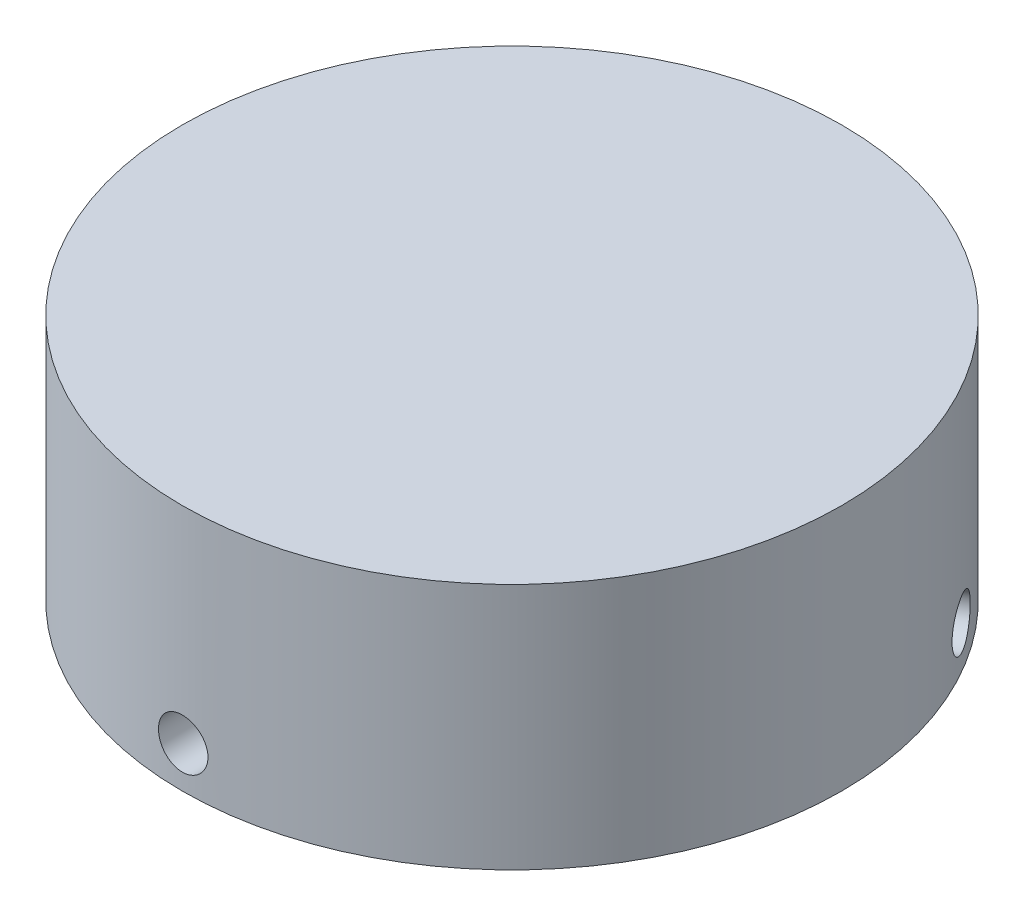
ISO-10303-21;
HEADER;
FILE_DESCRIPTION(('STEP AP214'),'2;1');
FILE_NAME('part.step','',(''),(''),'','','');
FILE_SCHEMA(('AUTOMOTIVE_DESIGN { 1 0 10303 214 1 1 1 1 }'));
ENDSEC;
DATA;
#1=APPLICATION_CONTEXT('core data for automotive mechanical design processes');
#2=APPLICATION_PROTOCOL_DEFINITION('international standard','automotive_design',2000,#1);
#3=PRODUCT_CONTEXT('',#1,'mechanical');
#4=PRODUCT('Part','Part','',(#3));
#5=PRODUCT_RELATED_PRODUCT_CATEGORY('part','',(#4));
#6=PRODUCT_DEFINITION_FORMATION('','',#4);
#7=PRODUCT_DEFINITION_CONTEXT('part definition',#1,'design');
#8=PRODUCT_DEFINITION('design','',#6,#7);
#9=PRODUCT_DEFINITION_SHAPE('','',#8);
#10=(LENGTH_UNIT() NAMED_UNIT(*) SI_UNIT(.MILLI.,.METRE.));
#11=(NAMED_UNIT(*) PLANE_ANGLE_UNIT() SI_UNIT($,.RADIAN.));
#12=(NAMED_UNIT(*) SI_UNIT($,.STERADIAN.) SOLID_ANGLE_UNIT());
#13=UNCERTAINTY_MEASURE_WITH_UNIT(LENGTH_MEASURE(1.E-05),#10,'distance_accuracy_value','');
#14=(GEOMETRIC_REPRESENTATION_CONTEXT(3) GLOBAL_UNCERTAINTY_ASSIGNED_CONTEXT((#13)) GLOBAL_UNIT_ASSIGNED_CONTEXT((#10,
#11,#12)) REPRESENTATION_CONTEXT('',''));
#15=CARTESIAN_POINT('',(0.,0.,0.));
#16=DIRECTION('',(0.,0.,1.));
#17=DIRECTION('',(1.,0.,0.));
#18=AXIS2_PLACEMENT_3D('',#15,#16,#17);
#19=CARTESIAN_POINT('',(0.,-63.9534883720931,0.));
#20=DIRECTION('',(0.,-1.,0.));
#21=DIRECTION('',(0.,0.,-1.));
#22=AXIS2_PLACEMENT_3D('',#19,#20,#21);
#23=CYLINDRICAL_SURFACE('',#22,40.);
#24=CARTESIAN_POINT('',(-36.0434508988317,5.,-17.345594463826));
#25=CARTESIAN_POINT('',(-36.0434485099029,5.1682568685558,-17.3456015996993));
#26=CARTESIAN_POINT('',(-36.0372814306523,5.33662970358921,-17.3584324834417));
#27=CARTESIAN_POINT('',(-36.012692785125,5.66872083129578,-17.4093861957378));
#28=CARTESIAN_POINT('',(-35.9942571691222,5.83243356289592,-17.4475380212816));
#29=CARTESIAN_POINT('',(-35.9454373561321,6.15034636686087,-17.5478952755415));
#30=CARTESIAN_POINT('',(-35.9150597301995,6.30455161679832,-17.6100874758004));
#31=CARTESIAN_POINT('',(-35.8428802841703,6.59914501091521,-17.756535842124));
#32=CARTESIAN_POINT('',(-35.8010809816004,6.7395361906805,-17.8407871458263));
#33=CARTESIAN_POINT('',(-35.7067170207569,7.00285004756748,-18.028905141259));
#34=CARTESIAN_POINT('',(-35.6541324482741,7.12573968779151,-18.1328080902756));
#35=CARTESIAN_POINT('',(-35.5392589522166,7.35027864929544,-18.3569304798962));
#36=CARTESIAN_POINT('',(-35.4769696132881,7.45192706103727,-18.47715061883));
#37=CARTESIAN_POINT('',(-35.343915021324,7.63120510416941,-18.7304064029075));
#38=CARTESIAN_POINT('',(-35.2731399709938,7.70880659418914,-18.8634568260775));
#39=CARTESIAN_POINT('',(-35.1247947586744,7.8376079242409,-19.1382640007978));
#40=CARTESIAN_POINT('',(-35.0472246955477,7.88880814831743,-19.2800206256703));
#41=CARTESIAN_POINT('',(-34.8873785317623,7.96325967860896,-19.567775599993));
#42=CARTESIAN_POINT('',(-34.8051116423367,7.98656384595592,-19.7137653882387));
#43=CARTESIAN_POINT('',(-34.6379542723222,8.00472508444834,-20.0060104969881));
#44=CARTESIAN_POINT('',(-34.5530638322075,7.99958259423026,-20.1522658133626));
#45=CARTESIAN_POINT('',(-34.3832793116365,7.96103987829183,-20.440598017982));
#46=CARTESIAN_POINT('',(-34.2983855818404,7.92769650231577,-20.5826827179069));
#47=CARTESIAN_POINT('',(-34.1310079202001,7.83378683220311,-20.8590607896552));
#48=CARTESIAN_POINT('',(-34.0485240075631,7.77322032115078,-20.9933540993866));
#49=CARTESIAN_POINT('',(-33.8885227127553,7.62651983963334,-21.250671312474));
#50=CARTESIAN_POINT('',(-33.8110103967526,7.54036027721805,-21.3736837735614));
#51=CARTESIAN_POINT('',(-33.6636297460356,7.34493803881548,-21.6050660641836));
#52=CARTESIAN_POINT('',(-33.5937615364539,7.23567498471384,-21.7134356540238));
#53=CARTESIAN_POINT('',(-33.4639307435979,6.99682664068514,-21.9130002114594));
#54=CARTESIAN_POINT('',(-33.4039929733102,6.86719197616823,-22.0041522350926));
#55=CARTESIAN_POINT('',(-33.2963918719693,6.59145272534244,-22.1666374512936));
#56=CARTESIAN_POINT('',(-33.2487285484692,6.44534812889871,-22.2379706316657));
#57=CARTESIAN_POINT('',(-33.1674417589666,6.14078299125034,-22.3590283895546));
#58=CARTESIAN_POINT('',(-33.1338195822937,5.98232131694056,-22.4087509826942));
#59=CARTESIAN_POINT('',(-33.0819019062815,5.65755583878136,-22.4853268872282));
#60=CARTESIAN_POINT('',(-33.063606146597,5.4912521681923,-22.5121805870899));
#61=CARTESIAN_POINT('',(-33.0430736411475,5.15595684618506,-22.5423073958953));
#62=CARTESIAN_POINT('',(-33.0407979103687,4.98697272381689,-22.5456377493711));
#63=CARTESIAN_POINT('',(-33.0522904001772,4.650732480299,-22.5287860142545));
#64=CARTESIAN_POINT('',(-33.0660584999243,4.48347634614387,-22.5086041027534));
#65=CARTESIAN_POINT('',(-33.1090812380939,4.15563685328747,-22.445270932589));
#66=CARTESIAN_POINT('',(-33.1383179166718,3.99504598856854,-22.402146311314));
#67=CARTESIAN_POINT('',(-33.2111557127067,3.68486346525242,-22.2940207406841));
#68=CARTESIAN_POINT('',(-33.2547570174012,3.53527195005865,-22.2290195061757));
#69=CARTESIAN_POINT('',(-33.3548010143253,3.2510178948854,-22.0786184214921));
#70=CARTESIAN_POINT('',(-33.4112682959468,3.11638468579604,-21.9931794951057));
#71=CARTESIAN_POINT('',(-33.5349513642252,2.86616500351318,-21.8041226276575));
#72=CARTESIAN_POINT('',(-33.6021673010943,2.75057879654675,-21.7005044325391));
#73=CARTESIAN_POINT('',(-33.7451344860045,2.54149949578429,-21.4775101342881));
#74=CARTESIAN_POINT('',(-33.8209025900598,2.44805119861195,-21.3581028291068));
#75=CARTESIAN_POINT('',(-33.978290512558,2.28620736981222,-21.1068169829454));
#76=CARTESIAN_POINT('',(-34.0599102821422,2.21781162903718,-20.9749385460904));
#77=CARTESIAN_POINT('',(-34.2262530314192,2.10809178329002,-20.7023922223846));
#78=CARTESIAN_POINT('',(-34.3109727073773,2.06673969558153,-20.5617335862905));
#79=CARTESIAN_POINT('',(-34.4809612959082,2.01218948059973,-20.2753796330501));
#80=CARTESIAN_POINT('',(-34.566230200236,1.9989909316717,-20.12968439137));
#81=CARTESIAN_POINT('',(-34.7346028700775,2.00112697442154,-19.8377340381758));
#82=CARTESIAN_POINT('',(-34.8177114351049,2.01639162912749,-19.6914811778025));
#83=CARTESIAN_POINT('',(-34.9797038345022,2.074875287663,-19.4022628445248));
#84=CARTESIAN_POINT('',(-35.0585876623101,2.11809433490976,-19.2592973767265));
#85=CARTESIAN_POINT('',(-35.2101249700807,2.23124296108666,-18.9808389329815));
#86=CARTESIAN_POINT('',(-35.2827786533884,2.30117166783664,-18.8453457132005));
#87=CARTESIAN_POINT('',(-35.4201619389372,2.46574606550691,-18.5858470491346));
#88=CARTESIAN_POINT('',(-35.4848917010844,2.56039125752356,-18.4618413730415));
#89=CARTESIAN_POINT('',(-35.6051854717505,2.77197362151664,-18.2287695213581));
#90=CARTESIAN_POINT('',(-35.6607277786153,2.88896220622358,-18.1197388182444));
#91=CARTESIAN_POINT('',(-35.7613780889198,3.14182472905697,-17.9202777392854));
#92=CARTESIAN_POINT('',(-35.8064835509577,3.27770325407113,-17.8298518943695));
#93=CARTESIAN_POINT('',(-35.8854769925181,3.56470461656404,-17.6703282958382));
#94=CARTESIAN_POINT('',(-35.9193469658944,3.71585142240695,-17.601264789646));
#95=CARTESIAN_POINT('',(-35.975153523787,4.02881845787131,-17.4869212490252));
#96=CARTESIAN_POINT('',(-35.9971039406574,4.19062607020459,-17.441613648561));
#97=CARTESIAN_POINT('',(-36.023083014419,4.4611699703097,-17.387869282753));
#98=CARTESIAN_POINT('',(-36.0307146053878,4.56816226000275,-17.372039165491));
#99=CARTESIAN_POINT('',(-36.0408993111863,4.78342034931307,-17.3508994702492));
#100=CARTESIAN_POINT('',(-36.0434524366832,4.8916861462549,-17.3455898701714));
#101=CARTESIAN_POINT('',(-36.0434508988317,5.,-17.345594463826));
#102=B_SPLINE_CURVE_WITH_KNOTS('',3,(#24,#25,#26,#27,#28,#29,#30,#31,#32,#33,#34,#35,#36,#37,
#38,#39,#40,#41,#42,#43,#44,#45,#46,#47,#48,#49,#50,#51,#52,#53,#54,#55,#56,#57,#58,#59,#60,#61,
#62,#63,#64,#65,#66,#67,#68,#69,#70,#71,#72,#73,#74,#75,#76,#77,#78,#79,#80,#81,#82,#83,#84,#85,
#86,#87,#88,#89,#90,#91,#92,#93,#94,#95,#96,#97,#98,#99,#100,#101),.UNSPECIFIED.,.T.,.F.,(4,2,2,
2,2,2,2,2,2,2,2,2,2,2,2,2,2,2,2,2,2,2,2,2,2,2,2,2,2,2,2,2,2,2,2,2,2,2,4),(0.,0.504375158678085,
1.00932891572159,1.51400521152437,2.01857035792287,2.52407567218004,3.0296026274716,
3.53571897042052,4.04182795096937,4.54697636348321,5.05211698682554,5.55624172519159,
6.06037048052796,6.5650050497415,7.06964787850087,7.5755332281276,8.08141888905544,
8.58735099277641,9.09327450220475,9.59796641118963,10.1026545189226,10.6067579386191,
11.110867929372,11.6159495765132,12.1210382827706,12.6271404816974,13.1332384554068,
13.638811924989,14.1443778225593,14.6487031301784,15.1530292210894,15.6573388450885,
16.1616382903561,16.6671124356828,17.1727095361933,17.6791130423731,18.1849276168994,
18.5096152946703,18.8343022904443),.UNSPECIFIED.);
#103=CARTESIAN_POINT('',(-36.0434508988317,5.,-17.345594463826));
#104=VERTEX_POINT('',#103);
#105=EDGE_CURVE('E92',#104,#104,#102,.T.);
#106=ORIENTED_EDGE('',*,*,#105,.F.);
#107=EDGE_LOOP('',(#106));
#108=FACE_BOUND('',#107,.T.);
#109=CARTESIAN_POINT('',(33.043450898832,5.,-22.5417468865321));
#110=CARTESIAN_POINT('',(33.0434558842151,5.1682568685558,-22.5417412497224));
#111=CARTESIAN_POINT('',(33.0514842158638,5.33662970358921,-22.5299849605531));
#112=CARTESIAN_POINT('',(33.0833171023657,5.66872083129578,-22.4832137127338));
#113=CARTESIAN_POINT('',(33.107139744486,5.83243356289592,-22.4481720881691));
#114=CARTESIAN_POINT('',(33.169641769634,6.15034636686087,-22.3557142627817));
#115=CARTESIAN_POINT('',(33.2083129820091,6.30455161679832,-22.2983103668879));
#116=CARTESIAN_POINT('',(33.2990512645736,6.59914501091521,-22.1625769498337));
#117=CARTESIAN_POINT('',(33.3511153825967,6.7395361906805,-22.0842520400966));
#118=CARTESIAN_POINT('',(33.4668483651288,7.00285004756747,-21.908471455088));
#119=CARTESIAN_POINT('',(33.5305386722639,7.1257396877915,-21.8109804049625));
#120=CARTESIAN_POINT('',(33.6671976072033,7.35027864929544,-21.5994358443449));
#121=CARTESIAN_POINT('',(33.7401666321023,7.45192706103727,-21.4853816249809));
#122=CARTESIAN_POINT('',(33.8929652787866,7.63120510416941,-21.2435250762111));
#123=CARTESIAN_POINT('',(33.9728028000711,7.70880659418913,-21.115706873086));
#124=CARTESIAN_POINT('',(34.1366201883614,7.83760792424089,-20.8498325633275));
#125=CARTESIAN_POINT('',(34.2205999950923,7.88880814831743,-20.7117766056504));
#126=CARTESIAN_POINT('',(34.3898800310285,7.96325967860896,-20.4294682799533));
#127=CARTESIAN_POINT('',(34.4751774516295,7.98656384595592,-20.2852281696976));
#128=CARTESIAN_POINT('',(34.644690454931,8.00472508444834,-19.9943430864605));
#129=CARTESIAN_POINT('',(34.7289060542926,7.99958259423026,-19.8476981505955));
#130=CARTESIAN_POINT('',(34.8937168079366,7.96103987829183,-19.556494340302));
#131=CARTESIAN_POINT('',(34.9743189026626,7.92769650231577,-19.4119318637141));
#132=CARTESIAN_POINT('',(35.1299805030254,7.83378683220312,-19.1287895208334));
#133=CARTESIAN_POINT('',(35.2050399644926,7.77322032115079,-18.9902097022205));
#134=CARTESIAN_POINT('',(35.3478825604534,7.62651983963334,-18.7229859097349));
#135=CARTESIAN_POINT('',(35.4156583187358,7.54036027721805,-18.5943520444267));
#136=CARTESIAN_POINT('',(35.5423509350419,7.34493803881549,-18.3510255115683));
#137=CARTESIAN_POINT('',(35.6012676480504,7.23567498471385,-18.2363330722336));
#138=CARTESIAN_POINT('',(35.7091802280566,6.99682664068515,-18.024114028709));
#139=CARTESIAN_POINT('',(35.7581513109855,6.86719197616823,-17.9266303851771));
#140=CARTESIAN_POINT('',(35.8450670852845,6.59145272534244,-17.7522024898402));
#141=CARTESIAN_POINT('',(35.8830117698695,6.44534812889871,-17.6752582506742));
#142=CARTESIAN_POINT('',(35.9472074687751,6.14078299125034,-17.5443329470284));
#143=CARTESIAN_POINT('',(35.9734574092396,5.98232131694056,-17.4903539913294));
#144=CARTESIAN_POINT('',(36.0138152498777,5.65755583878137,-17.4071040127304));
#145=CARTESIAN_POINT('',(36.0279233563013,5.4912521681923,-17.3778325701312));
#146=CARTESIAN_POINT('',(36.043747685337,5.15595684618506,-17.3449874944058));
#147=CARTESIAN_POINT('',(36.0454939906612,4.98697272381689,-17.3413514770013));
#148=CARTESIAN_POINT('',(36.0366462048566,4.65073248029901,-17.3597301326865));
#149=CARTESIAN_POINT('',(36.0260522066733,4.48347634614387,-17.38174461258));
#150=CARTESIAN_POINT('',(35.9927154414936,4.15563685328747,-17.4506699818574));
#151=CARTESIAN_POINT('',(35.9699867632298,3.99504598856854,-17.4975519988656));
#152=CARTESIAN_POINT('',(35.9127661702831,3.68486346525242,-17.6146941659025));
#153=CARTESIAN_POINT('',(35.8782741022687,3.53527195005865,-17.6849546206602));
#154=CARTESIAN_POINT('',(35.798044940638,3.25101789488541,-17.8467958058345));
#155=CARTESIAN_POINT('',(35.752286300726,3.11638468579605,-17.9384173693945));
#156=CARTESIAN_POINT('',(35.6503997848952,2.86616500351319,-18.1400584822657));
#157=CARTESIAN_POINT('',(35.5942717640629,2.75057879654675,-18.2500782886927));
#158=CARTESIAN_POINT('',(35.4726366293336,2.54149949578429,-18.485388651858));
#159=CARTESIAN_POINT('',(35.4071109216768,2.44805119861195,-18.6107094073572));
#160=CARTESIAN_POINT('',(35.2681849565387,2.28620736981222,-18.8726542695701));
#161=CARTESIAN_POINT('',(35.1947847648029,2.21781162903719,-19.0092782819086));
#162=CARTESIAN_POINT('',(35.0419240994041,2.10809178329002,-19.2896084903707));
#163=CARTESIAN_POINT('',(34.962469985264,2.06673969558153,-19.4333071999979));
#164=CARTESIAN_POINT('',(34.7994744815492,2.01218948059972,-19.7236986126393));
#165=CARTESIAN_POINT('',(34.7159331532076,1.9989909316717,-19.8703912707801));
#166=CARTESIAN_POINT('',(34.5472830656183,2.00112697442154,-20.1621814567629));
#167=CARTESIAN_POINT('',(34.4621786556727,2.01639162912749,-20.3072820155354));
#168=CARTESIAN_POINT('',(34.2927044315126,2.074875287663,-20.5921807152723));
#169=CARTESIAN_POINT('',(34.2083346184393,2.11809433490976,-20.7319788480008));
#170=CARTESIAN_POINT('',(34.0429511861432,2.23124296108666,-21.0024432280238));
#171=CARTESIAN_POINT('',(33.9619374574261,2.30117166783664,-21.1331097733373));
#172=CARTESIAN_POINT('',(33.8058966648713,2.46574606550691,-21.3818365207108));
#173=CARTESIAN_POINT('',(33.7308694802348,2.56039125752355,-21.4998969771577));
#174=CARTESIAN_POINT('',(33.5891702211029,2.77197362151663,-21.7206103643133));
#175=CARTESIAN_POINT('',(33.5225180158464,2.88896220622357,-21.8232267645999));
#176=CARTESIAN_POINT('',(33.400104809554,3.14182472905697,-22.0101230297019));
#177=CARTESIAN_POINT('',(33.3443464617171,3.27770325407113,-22.0943984281341));
#178=CARTESIAN_POINT('',(33.245691693666,3.56470461656404,-22.2425705545234));
#179=CARTESIAN_POINT('',(33.2028159295173,3.71585142240695,-22.3064345649889));
#180=CARTESIAN_POINT('',(33.1316947975274,4.02881845787131,-22.4119362321321));
#181=CARTESIAN_POINT('',(33.1034324729761,4.19062607020459,-22.4535996509975));
#182=CARTESIAN_POINT('',(33.0698780237569,4.4611699703097,-22.5029703717459));
#183=CARTESIAN_POINT('',(33.0599845355475,4.56816226000274,-22.5174945820272));
#184=CARTESIAN_POINT('',(33.046769375339,4.78342034931307,-22.5368846435997));
#185=CARTESIAN_POINT('',(33.0434476895361,4.8916861462549,-22.5417505151779));
#186=CARTESIAN_POINT('',(33.043450898832,5.,-22.5417468865321));
#187=B_SPLINE_CURVE_WITH_KNOTS('',3,(#109,#110,#111,#112,#113,#114,#115,#116,#117,#118,#119,
#120,#121,#122,#123,#124,#125,#126,#127,#128,#129,#130,#131,#132,#133,#134,#135,#136,#137,#138,
#139,#140,#141,#142,#143,#144,#145,#146,#147,#148,#149,#150,#151,#152,#153,#154,#155,#156,#157,
#158,#159,#160,#161,#162,#163,#164,#165,#166,#167,#168,#169,#170,#171,#172,#173,#174,#175,#176,
#177,#178,#179,#180,#181,#182,#183,#184,#185,#186),.UNSPECIFIED.,.T.,.F.,(4,2,2,2,2,2,2,2,2,2,2,
2,2,2,2,2,2,2,2,2,2,2,2,2,2,2,2,2,2,2,2,2,2,2,2,2,2,2,4),(0.,0.504375158678084,1.00932891572159,
1.51400521152437,2.01857035792286,2.52407567218003,3.0296026274716,3.5357189704205,
4.04182795096935,4.5469763634832,5.05211698682554,5.55624172519158,6.06037048052794,
6.56500504974148,7.06964787850086,7.57553322812759,8.08141888905544,8.5873509927764,
9.09327450220474,9.59796641118962,10.1026545189226,10.6067579386191,11.110867929372,
11.6159495765132,12.1210382827706,12.6271404816974,13.1332384554068,13.638811924989,
14.1443778225593,14.6487031301784,15.1530292210894,15.6573388450885,16.1616382903561,
16.6671124356828,17.1727095361933,17.6791130423731,18.1849276168994,18.5096152946703,
18.8343022904443),.UNSPECIFIED.);
#188=CARTESIAN_POINT('',(33.043450898832,5.,-22.5417468865321));
#189=VERTEX_POINT('',#188);
#190=EDGE_CURVE('E96',#189,#189,#187,.T.);
#191=ORIENTED_EDGE('',*,*,#190,.F.);
#192=EDGE_LOOP('',(#191));
#193=FACE_BOUND('',#192,.T.);
#194=CARTESIAN_POINT('',(3.,5.,39.8873413503583));
#195=CARTESIAN_POINT('',(2.99999262568802,5.1682568685558,39.8873428494219));
#196=CARTESIAN_POINT('',(2.98579721478878,5.33662970358921,39.8884174439949));
#197=CARTESIAN_POINT('',(2.92937568275962,5.66872083129578,39.8925999084717));
#198=CARTESIAN_POINT('',(2.88711742463658,5.83243356289592,39.8957101094508));
#199=CARTESIAN_POINT('',(2.77579558649838,6.15034636686087,39.9036095383233));
#200=CARTESIAN_POINT('',(2.7067467481906,6.30455161679832,39.9083978426884));
#201=CARTESIAN_POINT('',(2.54382901959703,6.59914501091521,39.9191127919579));
#202=CARTESIAN_POINT('',(2.44996559900398,6.7395361906805,39.925039185923));
#203=CARTESIAN_POINT('',(2.23986865562846,7.00285004756747,39.9373765963472));
#204=CARTESIAN_POINT('',(2.12359377601058,7.1257396877915,39.9437884952383));
#205=CARTESIAN_POINT('',(1.87206134501354,7.35027864929543,39.9563663242412));
#206=CARTESIAN_POINT('',(1.73680298118608,7.45192706103727,39.9625322438111));
#207=CARTESIAN_POINT('',(1.4509497425376,7.63120510416941,39.9739314791187));
#208=CARTESIAN_POINT('',(1.300337170923,7.70880659418914,39.9791636991637));
#209=CARTESIAN_POINT('',(0.988174570313298,7.8376079242409,39.9880965641254));
#210=CARTESIAN_POINT('',(0.826624700455656,7.88880814831743,39.9917972313208));
#211=CARTESIAN_POINT('',(0.497498500734078,7.96325967860896,39.9972438799465));
#212=CARTESIAN_POINT('',(0.329934190707409,7.98656384595592,39.9989935579364));
#213=CARTESIAN_POINT('',(-0.00673618260852872,8.00472508444834,40.0003535834487));
#214=CARTESIAN_POINT('',(-0.175842222084783,7.99958259423026,39.9999639639583));
#215=CARTESIAN_POINT('',(-0.510437496299822,7.96103987829183,39.9970923582842));
#216=CARTESIAN_POINT('',(-0.675933320821946,7.92769650231577,39.9946145816211));
#217=CARTESIAN_POINT('',(-0.998972582825042,7.83378683220311,39.9878503104887));
#218=CARTESIAN_POINT('',(-1.15651595692924,7.77322032115078,39.9835638016073));
#219=CARTESIAN_POINT('',(-1.45935984769784,7.62651983963334,39.9736572222091));
#220=CARTESIAN_POINT('',(-1.60464792198295,7.54036027721805,39.9680358179883));
#221=CARTESIAN_POINT('',(-1.87872118900609,7.34493803881548,39.9560915757521));
#222=CARTESIAN_POINT('',(-2.00750611159625,7.23567498471385,39.9497687262575));
#223=CARTESIAN_POINT('',(-2.24524948445845,6.99682664068515,39.9371142401685));
#224=CARTESIAN_POINT('',(-2.35415833767499,6.86719197616823,39.9307826202698));
#225=CARTESIAN_POINT('',(-2.54867521331495,6.59145272534244,39.9188399411339));
#226=CARTESIAN_POINT('',(-2.63428322139997,6.44534812889871,39.9132288823401));
#227=CARTESIAN_POINT('',(-2.7797657098083,6.14078299125034,39.9033613365832));
#228=CARTESIAN_POINT('',(-2.8396378269456,5.98232131694056,39.8991049740237));
#229=CARTESIAN_POINT('',(-2.9319133435959,5.65755583878137,39.8924308999587));
#230=CARTESIAN_POINT('',(-2.96431720970403,5.4912521681923,39.8900131572212));
#231=CARTESIAN_POINT('',(-3.00067404418927,5.15595684618506,39.8872948903014));
#232=CARTESIAN_POINT('',(-3.00469608029231,4.98697272381689,39.8869892263727));
#233=CARTESIAN_POINT('',(-2.98435580467917,4.650732480299,39.8885161469412));
#234=CARTESIAN_POINT('',(-2.95999370674874,4.48347634614387,39.8903487153335));
#235=CARTESIAN_POINT('',(-2.88363420339939,4.15563685328747,39.8959409144466));
#236=CARTESIAN_POINT('',(-2.8316688465577,3.99504598856854,39.8996983101798));
#237=CARTESIAN_POINT('',(-2.70161045757609,3.68486346525242,39.9087149065868));
#238=CARTESIAN_POINT('',(-2.62351708486722,3.53527195005865,39.9139741268361));
#239=CARTESIAN_POINT('',(-2.44324392631239,3.2510178948854,39.9254142273267));
#240=CARTESIAN_POINT('',(-2.34101800477895,3.11638468579604,39.9315968645004));
#241=CARTESIAN_POINT('',(-2.11544842066971,2.86616500351318,39.9441811099234));
#242=CARTESIAN_POINT('',(-1.99210446296835,2.75057879654675,39.950582721232));
#243=CARTESIAN_POINT('',(-1.7275021433288,2.54149949578429,39.9628987861463));
#244=CARTESIAN_POINT('',(-1.58620833161667,2.44805119861195,39.9688122364642));
#245=CARTESIAN_POINT('',(-1.28989444398038,2.28620736981222,39.9794712525157));
#246=CARTESIAN_POINT('',(-1.13487448266042,2.21781162903718,39.9842168279992));
#247=CARTESIAN_POINT('',(-0.815671067984652,2.10809178329002,39.9920007127554));
#248=CARTESIAN_POINT('',(-0.651497277886454,2.06673969558153,39.9950407862885));
#249=CARTESIAN_POINT('',(-0.318513185640664,2.01218948059973,39.9990782456896));
#250=CARTESIAN_POINT('',(-0.149702952971289,1.9989909316717,40.0000756621502));
#251=CARTESIAN_POINT('',(0.187319804459422,2.00112697442154,39.9999154949388));
#252=CARTESIAN_POINT('',(0.35553277943255,2.01639162912749,39.9987631933381));
#253=CARTESIAN_POINT('',(0.686999402989866,2.074875287663,39.9944435597973));
#254=CARTESIAN_POINT('',(0.850253043871079,2.11809433490976,39.9912762247275));
#255=CARTESIAN_POINT('',(1.16717378393784,2.23124296108666,39.9832821610055));
#256=CARTESIAN_POINT('',(1.32084119596258,2.30117166783664,39.9784554865379));
#257=CARTESIAN_POINT('',(1.61426527406613,2.46574606550691,39.9676835698456));
#258=CARTESIAN_POINT('',(1.75402222084985,2.56039125752355,39.9617383501994));
#259=CARTESIAN_POINT('',(2.01601525064781,2.77197362151663,39.9493798856716));
#260=CARTESIAN_POINT('',(2.1382097627692,2.88896220622358,39.9429655828445));
#261=CARTESIAN_POINT('',(2.36127327936613,3.14182472905697,39.9304007689875));
#262=CARTESIAN_POINT('',(2.46213708924093,3.27770325407114,39.9242503225038));
#263=CARTESIAN_POINT('',(2.63978529885239,3.56470461656404,39.9128988503618));
#264=CARTESIAN_POINT('',(2.71653103637741,3.71585142240695,39.907699354635));
#265=CARTESIAN_POINT('',(2.84345872625994,4.02881845787131,39.8988574811574));
#266=CARTESIAN_POINT('',(2.89367146768162,4.19062607020459,39.8952132995587));
#267=CARTESIAN_POINT('',(2.95320499066245,4.4611699703097,39.8908396544991));
#268=CARTESIAN_POINT('',(2.97073006984063,4.56816226000275,39.8895337475184));
#269=CARTESIAN_POINT('',(2.99412993584758,4.78342034931307,39.887784113849));
#270=CARTESIAN_POINT('',(3.00000474714736,4.8916861462549,39.8873403853495));
#271=CARTESIAN_POINT('',(3.,5.,39.8873413503583));
#272=B_SPLINE_CURVE_WITH_KNOTS('',3,(#194,#195,#196,#197,#198,#199,#200,#201,#202,#203,#204,
#205,#206,#207,#208,#209,#210,#211,#212,#213,#214,#215,#216,#217,#218,#219,#220,#221,#222,#223,
#224,#225,#226,#227,#228,#229,#230,#231,#232,#233,#234,#235,#236,#237,#238,#239,#240,#241,#242,
#243,#244,#245,#246,#247,#248,#249,#250,#251,#252,#253,#254,#255,#256,#257,#258,#259,#260,#261,
#262,#263,#264,#265,#266,#267,#268,#269,#270,#271),.UNSPECIFIED.,.T.,.F.,(4,2,2,2,2,2,2,2,2,2,2,
2,2,2,2,2,2,2,2,2,2,2,2,2,2,2,2,2,2,2,2,2,2,2,2,2,2,2,4),(0.,0.504375158678084,1.00932891572159,
1.51400521152437,2.01857035792286,2.52407567218003,3.0296026274716,3.53571897042051,
4.04182795096936,4.54697636348321,5.05211698682554,5.55624172519159,6.06037048052796,
6.56500504974149,7.06964787850087,7.57553322812759,8.08141888905544,8.58735099277641,
9.09327450220475,9.59796641118963,10.1026545189226,10.6067579386191,11.110867929372,
11.6159495765132,12.1210382827706,12.6271404816974,13.1332384554068,13.638811924989,
14.1443778225593,14.6487031301784,15.1530292210894,15.6573388450885,16.1616382903561,
16.6671124356828,17.1727095361933,17.6791130423731,18.1849276168994,18.5096152946703,
18.8343022904443),.UNSPECIFIED.);
#273=CARTESIAN_POINT('',(3.,5.,39.8873413503583));
#274=VERTEX_POINT('',#273);
#275=EDGE_CURVE('E52',#274,#274,#272,.T.);
#276=ORIENTED_EDGE('',*,*,#275,.F.);
#277=EDGE_LOOP('',(#276));
#278=FACE_BOUND('',#277,.T.);
#279=CARTESIAN_POINT('',(0.,0.,0.));
#280=DIRECTION('',(0.,-1.,0.));
#281=DIRECTION('',(0.,0.,-1.));
#282=AXIS2_PLACEMENT_3D('',#279,#280,#281);
#283=CIRCLE('',#282,40.);
#284=CARTESIAN_POINT('',(0.,0.,-40.));
#285=VERTEX_POINT('',#284);
#286=EDGE_CURVE('E47',#285,#285,#283,.T.);
#287=ORIENTED_EDGE('',*,*,#286,.F.);
#288=EDGE_LOOP('',(#287));
#289=FACE_BOUND('',#288,.T.);
#290=CARTESIAN_POINT('',(0.,30.,0.));
#291=DIRECTION('',(0.,-1.,0.));
#292=DIRECTION('',(0.,0.,-1.));
#293=AXIS2_PLACEMENT_3D('',#290,#291,#292);
#294=CIRCLE('',#293,40.);
#295=CARTESIAN_POINT('',(0.,30.,-40.));
#296=VERTEX_POINT('',#295);
#297=EDGE_CURVE('E10',#296,#296,#294,.T.);
#298=ORIENTED_EDGE('',*,*,#297,.T.);
#299=EDGE_LOOP('',(#298));
#300=FACE_BOUND('',#299,.T.);
#301=ADVANCED_FACE('F33',(#108,#193,#278,#289,#300),#23,.T.);
#302=CARTESIAN_POINT('',(-40.,30.,0.));
#303=DIRECTION('',(0.,-1.,0.));
#304=DIRECTION('',(0.,0.,-1.));
#305=AXIS2_PLACEMENT_3D('',#302,#303,#304);
#306=PLANE('',#305);
#307=ORIENTED_EDGE('',*,*,#297,.F.);
#308=EDGE_LOOP('',(#307));
#309=FACE_BOUND('',#308,.T.);
#310=ADVANCED_FACE('F80',(#309),#306,.F.);
#311=CARTESIAN_POINT('',(0.,25.,0.));
#312=DIRECTION('',(0.,1.,0.));
#313=DIRECTION('',(0.,0.,1.));
#314=AXIS2_PLACEMENT_3D('',#311,#312,#313);
#315=PLANE('',#314);
#316=CARTESIAN_POINT('',(0.,25.,0.));
#317=DIRECTION('',(0.,-1.,0.));
#318=DIRECTION('',(0.,0.,-1.));
#319=AXIS2_PLACEMENT_3D('',#316,#317,#318);
#320=CIRCLE('',#319,35.);
#321=CARTESIAN_POINT('',(0.,25.,-35.));
#322=VERTEX_POINT('',#321);
#323=EDGE_CURVE('E39',#322,#322,#320,.T.);
#324=ORIENTED_EDGE('',*,*,#323,.T.);
#325=EDGE_LOOP('',(#324));
#326=FACE_BOUND('',#325,.T.);
#327=ADVANCED_FACE('F77',(#326),#315,.F.);
#328=CARTESIAN_POINT('',(0.,-63.9534883720931,0.));
#329=DIRECTION('',(0.,-1.,0.));
#330=DIRECTION('',(0.,0.,-1.));
#331=AXIS2_PLACEMENT_3D('',#328,#329,#330);
#332=CYLINDRICAL_SURFACE('',#331,35.);
#333=CARTESIAN_POINT('',(-31.6993377410829,5.,-14.8375195628095));
#334=CARTESIAN_POINT('',(-31.6993355474285,4.83182110220312,-14.8375267706995));
#335=CARTESIAN_POINT('',(-31.6933079127272,4.6635281444135,-14.8504230419554));
#336=CARTESIAN_POINT('',(-31.6692637457543,4.33159992889202,-14.9016275265098));
#337=CARTESIAN_POINT('',(-31.6512336780234,4.16797014744623,-14.9399644297251));
#338=CARTESIAN_POINT('',(-31.6034490090532,3.85022368351939,-15.0407813611578));
#339=CARTESIAN_POINT('',(-31.5737011153164,3.69610161691769,-15.1032475769103));
#340=CARTESIAN_POINT('',(-31.5029384740131,3.40165820131931,-15.2502948544938));
#341=CARTESIAN_POINT('',(-31.4619261125039,3.26133393818889,-15.3348712327325));
#342=CARTESIAN_POINT('',(-31.3691852996159,2.99805317899114,-15.5237003256633));
#343=CARTESIAN_POINT('',(-31.3174313409714,2.87513921650706,-15.6279998219832));
#344=CARTESIAN_POINT('',(-31.2041875525536,2.65053366426425,-15.8529018638792));
#345=CARTESIAN_POINT('',(-31.1426972950232,2.54884300739128,-15.9735051257153));
#346=CARTESIAN_POINT('',(-31.0110951669304,2.36942830362212,-16.2275209844633));
#347=CARTESIAN_POINT('',(-30.9409702379859,2.29174119609241,-16.3609529139425));
#348=CARTESIAN_POINT('',(-30.7937213671833,2.16277512639066,-16.6364386863232));
#349=CARTESIAN_POINT('',(-30.7165975541843,2.11149567813343,-16.7784923704705));
#350=CARTESIAN_POINT('',(-30.5574353417916,2.03692337559085,-17.0666386367993));
#351=CARTESIAN_POINT('',(-30.4754095859762,2.01356152909635,-17.2127203457848));
#352=CARTESIAN_POINT('',(-30.3084643635952,1.99527428308786,-17.5050080891657));
#353=CARTESIAN_POINT('',(-30.2235449536737,2.00034832725016,-17.6512141210729));
#354=CARTESIAN_POINT('',(-30.0534929178141,2.03873246102892,-17.9392158507807));
#355=CARTESIAN_POINT('',(-29.9683614375479,2.07196836038356,-18.0810221228558));
#356=CARTESIAN_POINT('',(-29.8002772342064,2.16561737123898,-18.3567307075397));
#357=CARTESIAN_POINT('',(-29.7173245328857,2.22603075399064,-18.4906329412455));
#358=CARTESIAN_POINT('',(-29.55618139008,2.37240232714898,-18.7471368054528));
#359=CARTESIAN_POINT('',(-29.477997293087,2.45839369186082,-18.8697234876029));
#360=CARTESIAN_POINT('',(-29.329165252444,2.6534561621967,-19.1002334962758));
#361=CARTESIAN_POINT('',(-29.2585174707027,2.76252776352179,-19.208156507781));
#362=CARTESIAN_POINT('',(-29.1270479808863,3.00107258841207,-19.4069408928311));
#363=CARTESIAN_POINT('',(-29.0662586003546,3.13061028823158,-19.4977462864927));
#364=CARTESIAN_POINT('',(-28.9570303549841,3.40618566384501,-19.6596021787964));
#365=CARTESIAN_POINT('',(-28.9085915012042,3.55222335441313,-19.7306526597495));
#366=CARTESIAN_POINT('',(-28.8259114332634,3.85669919114177,-19.851251929562));
#367=CARTESIAN_POINT('',(-28.7916721174494,4.01513899198607,-19.9007978435008));
#368=CARTESIAN_POINT('',(-28.7387492014963,4.33989948862507,-19.9771487298717));
#369=CARTESIAN_POINT('',(-28.7200652550904,4.50622000890571,-20.0039542085124));
#370=CARTESIAN_POINT('',(-28.6990351966099,4.84145480950811,-20.034113967633));
#371=CARTESIAN_POINT('',(-28.6966373460487,5.01035916582621,-20.0375425132618));
#372=CARTESIAN_POINT('',(-28.7081384662056,5.34646416851566,-20.0210609820554));
#373=CARTESIAN_POINT('',(-28.72203727597,5.51366483169707,-20.0011511357218));
#374=CARTESIAN_POINT('',(-28.7655415502781,5.84135680518107,-19.9385318969368));
#375=CARTESIAN_POINT('',(-28.795123020415,6.00185796211468,-19.8958573337914));
#376=CARTESIAN_POINT('',(-28.8688165582247,6.31190003889466,-19.7887753633423));
#377=CARTESIAN_POINT('',(-28.9129288723111,6.461440772822,-19.7243675874873));
#378=CARTESIAN_POINT('',(-29.0141241073333,6.74572956800827,-19.5752066212797));
#379=CARTESIAN_POINT('',(-29.0712393280241,6.88043953139293,-19.4904027360352));
#380=CARTESIAN_POINT('',(-29.1962526638784,7.1308576448824,-19.302629847062));
#381=CARTESIAN_POINT('',(-29.264150975257,7.2465654491355,-19.1996605127808));
#382=CARTESIAN_POINT('',(-29.408483781682,7.45600297288432,-18.9778450451139));
#383=CARTESIAN_POINT('',(-29.4849402660236,7.54967406543698,-18.858957851517));
#384=CARTESIAN_POINT('',(-29.64359052085,7.71197677172136,-18.6085860631289));
#385=CARTESIAN_POINT('',(-29.7257842311431,7.78060864810317,-18.4771016004956));
#386=CARTESIAN_POINT('',(-29.8930681082947,7.89078420870841,-18.2052162901554));
#387=CARTESIAN_POINT('',(-29.9781542500806,7.93236403536096,-18.0648276152972));
#388=CARTESIAN_POINT('',(-30.1486478856728,7.98737330138224,-17.7788282380026));
#389=CARTESIAN_POINT('',(-30.234055372974,8.00080330756184,-17.6332176407723));
#390=CARTESIAN_POINT('',(-30.4023938789932,7.9991249178628,-17.3413591599725));
#391=CARTESIAN_POINT('',(-30.4853319569704,7.98410784201713,-17.1951148142023));
#392=CARTESIAN_POINT('',(-30.6467547280445,7.92615214085733,-16.9057352857155));
#393=CARTESIAN_POINT('',(-30.7252394153858,7.88321347945824,-16.7626001070173));
#394=CARTESIAN_POINT('',(-30.8757911074189,7.7706569781232,-16.4836483809795));
#395=CARTESIAN_POINT('',(-30.947858540913,7.70104092242804,-16.3478313448797));
#396=CARTESIAN_POINT('',(-31.0839547837021,7.53711611536773,-16.0875526619888));
#397=CARTESIAN_POINT('',(-31.1479837094471,7.44280772176972,-15.9630908507072));
#398=CARTESIAN_POINT('',(-31.2668889101178,7.23183243845914,-15.7289219638973));
#399=CARTESIAN_POINT('',(-31.3217365219968,7.11509788612735,-15.6192612949511));
#400=CARTESIAN_POINT('',(-31.4210438574192,6.86270820727993,-15.4185142419734));
#401=CARTESIAN_POINT('',(-31.465501065205,6.7270485112192,-15.3274323569737));
#402=CARTESIAN_POINT('',(-31.5433425985919,6.44038133499366,-15.1665936200246));
#403=CARTESIAN_POINT('',(-31.5767050499487,6.28934429352082,-15.096878916213));
#404=CARTESIAN_POINT('',(-31.6316899560069,5.97652677723951,-14.9813324820185));
#405=CARTESIAN_POINT('',(-31.653325875478,5.81475886463371,-14.9354733623551));
#406=CARTESIAN_POINT('',(-31.6790654713475,5.54336792192079,-14.8807707644004));
#407=CARTESIAN_POINT('',(-31.6866617646195,5.43548904288105,-14.8645757059903));
#408=CARTESIAN_POINT('',(-31.6967986046329,5.21842281309297,-14.8429477798276));
#409=CARTESIAN_POINT('',(-31.6993391659042,5.10923546610603,-14.8375148811447));
#410=CARTESIAN_POINT('',(-31.6993377410829,5.,-14.8375195628095));
#411=B_SPLINE_CURVE_WITH_KNOTS('',3,(#333,#334,#335,#336,#337,#338,#339,#340,#341,#342,#343,
#344,#345,#346,#347,#348,#349,#350,#351,#352,#353,#354,#355,#356,#357,#358,#359,#360,#361,#362,
#363,#364,#365,#366,#367,#368,#369,#370,#371,#372,#373,#374,#375,#376,#377,#378,#379,#380,#381,
#382,#383,#384,#385,#386,#387,#388,#389,#390,#391,#392,#393,#394,#395,#396,#397,#398,#399,#400,
#401,#402,#403,#404,#405,#406,#407,#408,#409,#410),.UNSPECIFIED.,.T.,.F.,(4,2,2,2,2,2,2,2,2,2,2,
2,2,2,2,2,2,2,2,2,2,2,2,2,2,2,2,2,2,2,2,2,2,2,2,2,2,2,4),(0.,0.504137845154906,1.0088451851254,
1.51326404003696,2.01757613044269,2.52309976273197,3.0286456110007,3.53496561920689,
4.04127630725863,4.54633315507159,5.0513801219166,5.55510070289604,6.05882631148134,
6.56320811562686,7.06760075362891,7.57361533214637,8.07963036375614,8.58571302310648,
9.09178441661877,9.5962473420388,10.1007052851759,10.6043936277359,11.1080905122643,
11.6130525231886,12.1180237237333,12.6243235404852,13.1306180462274,13.6362347291713,
14.1418412311696,14.6458273992463,15.1498142186598,15.6537673362459,16.1577131524622,
16.6632040203355,17.1688171527569,17.6754213142688,18.1814425380561,18.5088908177617,
18.836338156391),.UNSPECIFIED.);
#412=CARTESIAN_POINT('',(-31.6993377410829,5.,-14.8375195628095));
#413=VERTEX_POINT('',#412);
#414=EDGE_CURVE('E114',#413,#413,#411,.T.);
#415=ORIENTED_EDGE('',*,*,#414,.F.);
#416=EDGE_LOOP('',(#415));
#417=FACE_BOUND('',#416,.T.);
#418=CARTESIAN_POINT('',(28.6993377410832,5.,-20.0336719855157));
#419=CARTESIAN_POINT('',(28.6993428864718,4.83182110220312,-20.0336664818102));
#420=CARTESIAN_POINT('',(28.7074975676428,4.6635281444135,-20.0219982614063));
#421=CARTESIAN_POINT('',(28.7398198685682,4.33159992889202,-19.9755731597177));
#422=CARTESIAN_POINT('',(28.7640055667897,4.16797014744623,-19.9407902114232));
#423=CARTESIAN_POINT('',(28.8274232560568,3.85022368351939,-19.8489990084672));
#424=CARTESIAN_POINT('',(28.8666466389084,3.6961016169177,-19.7920034689058));
#425=CARTESIAN_POINT('',(28.9586119962014,3.40165820131932,-19.6571975851065));
#426=CARTESIAN_POINT('',(29.0113511075616,3.2613339381889,-19.579391649051));
#427=CARTESIAN_POINT('',(29.1285114925692,2.99805317899115,-19.404661202657));
#428=CARTESIAN_POINT('',(29.192960526662,2.87513921650707,-19.3076912115644));
#429=CARTESIAN_POINT('',(29.331109514098,2.65053366426425,-19.0971681930259));
#430=CARTESIAN_POINT('',(29.4048098738621,2.54884300739129,-18.9836144370013));
#431=CARTESIAN_POINT('',(29.5589929964556,2.36942830362213,-18.7426357215068));
#432=CARTESIAN_POINT('',(29.6394859725883,2.2917411960924,-18.6151897868627));
#433=CARTESIAN_POINT('',(29.8044392144499,2.16277512639066,-18.3499256378787));
#434=CARTESIAN_POINT('',(29.888899407123,2.11149567813343,-18.2121076145111));
#435=CARTESIAN_POINT('',(30.0588602875731,2.03692337559085,-17.9301959620922));
#436=CARTESIAN_POINT('',(30.144357880675,2.01356152909635,-17.7861187192987));
#437=CARTESIAN_POINT('',(30.3140138804672,1.99527428308786,-17.4953960439858));
#438=CARTESIAN_POINT('',(30.3981723133247,2.00034832725016,-17.3487506617658));
#439=CARTESIAN_POINT('',(30.5625631096557,2.03873246102892,-17.0574804138922));
#440=CARTESIAN_POINT('',(30.6428052035556,2.07196836038356,-16.9128512532824));
#441=CARTESIAN_POINT('',(30.7975337402626,2.16561737123898,-16.6294317708718));
#442=CARTESIAN_POINT('',(30.8720201256149,2.22603075399063,-16.4906415073626));
#443=CARTESIAN_POINT('',(31.0135874167845,2.37240232714897,-16.2228355199436));
#444=CARTESIAN_POINT('',(31.0806585491956,2.45839369186082,-16.0938327647007));
#445=CARTESIAN_POINT('',(31.2058700522114,2.6534561621967,-15.8496854322703));
#446=CARTESIAN_POINT('',(31.2640102309571,2.76252776352178,-15.7345411528087));
#447=CARTESIAN_POINT('',(31.370427813378,3.00107258841207,-15.5212930422801));
#448=CARTESIAN_POINT('',(31.4186729008238,3.13061028823159,-15.4232451976285));
#449=CARTESIAN_POINT('',(31.5042300926257,3.40618566384502,-15.247722816175));
#450=CARTESIAN_POINT('',(31.5415421871923,3.55222335441313,-15.1702482977949));
#451=CARTESIAN_POINT('',(31.6046441845573,3.85669919114177,-15.0383456236652));
#452=CARTESIAN_POINT('',(31.630432546775,4.01513899198607,-14.9839205493927));
#453=CARTESIAN_POINT('',(31.6700928959972,4.33989948862507,-14.8999125165495));
#454=CARTESIAN_POINT('',(31.6839651482577,4.50622000890571,-14.8703290049988));
#455=CARTESIAN_POINT('',(31.6995692365879,4.84145480950811,-14.8370365605512));
#456=CARTESIAN_POINT('',(31.7013395189198,5.01035916582621,-14.8332456882363));
#457=CARTESIAN_POINT('',(31.6928166542803,5.34646416851566,-14.8514467160674));
#458=CARTESIAN_POINT('',(31.6825236264521,5.51366483169707,-14.8734383615725));
#459=CARTESIAN_POINT('',(31.6500459120528,5.84135680518107,-14.9424237876891));
#460=CARTESIAN_POINT('',(31.6278793913418,6.00185796211468,-14.9893793738816));
#461=CARTESIAN_POINT('',(31.5719904535505,6.31190003889466,-15.1067408349441));
#462=CARTESIAN_POINT('',(31.538267840502,6.461440772822,-15.1771471074902));
#463=CARTESIAN_POINT('',(31.4596882720242,6.74572956800827,-15.3393652348652));
#464=CARTESIAN_POINT('',(31.4148035634084,6.88043953139292,-15.4312304095484));
#465=CARTESIAN_POINT('',(31.3146941393427,7.1308576448824,-15.6333815786967));
#466=CARTESIAN_POINT('',(31.2594692357337,7.2465654491355,-15.7436679083651));
#467=CARTESIAN_POINT('',(31.1395378089943,7.45600297288433,-15.9795715191622));
#468=CARTESIAN_POINT('',(31.0748067213256,7.54967406543698,-16.1052283736845));
#469=CARTESIAN_POINT('',(30.9373035196038,7.71197677172136,-16.3678094188751));
#470=CARTESIAN_POINT('',(30.864531489907,7.78060864810317,-16.5047334913369));
#471=CARTESIAN_POINT('',(30.7127138428123,7.89078420870841,-16.7855482337638));
#472=CARTESIAN_POINT('',(30.6336767548744,7.93236403536096,-16.9294293314895));
#473=CARTESIAN_POINT('',(30.4712408464668,7.98737330138224,-17.2200808397433));
#474=CARTESIAN_POINT('',(30.3878421138558,8.00080330756183,-17.3668511920346));
#475=CARTESIAN_POINT('',(30.2192545081828,7.9991249178628,-17.6585658550822));
#476=CARTESIAN_POINT('',(30.1340722285746,7.98410784201713,-17.8035145104366));
#477=CARTESIAN_POINT('',(29.9641735911069,7.92615214085733,-18.0880004951795));
#478=CARTESIAN_POINT('',(29.8794572338497,7.88321347945824,-18.2275378175742));
#479=CARTESIAN_POINT('',(29.713153798688,7.7706569781232,-18.4973952704765));
#480=CARTESIAN_POINT('',(29.631566511906,7.70104092242804,-18.6277160167179));
#481=CARTESIAN_POINT('',(29.4742066818535,7.53711611536773,-18.8757181617783));
#482=CARTESIAN_POINT('',(29.398434054355,7.44280772176972,-18.9933997436913));
#483=CARTESIAN_POINT('',(29.2550904499371,7.23183243845914,-19.2134591115192));
#484=CARTESIAN_POINT('',(29.1875453307732,7.11509788612734,-19.3157888712164));
#485=CARTESIAN_POINT('',(29.0633469508708,6.86270820727993,-19.5021650729632));
#486=CARTESIAN_POINT('',(29.0066963285294,6.7270485112192,-19.5862070867868));
#487=CARTESIAN_POINT('',(28.9063266631123,6.44038133499366,-19.734039200644));
#488=CARTESIAN_POINT('',(28.8626331842726,6.28934429352082,-19.7977892829573));
#489=CARTESIAN_POINT('',(28.7900594899725,5.9765267772395,-19.9031808255257));
#490=CARTESIAN_POINT('',(28.7611622870844,5.8147588646337,-19.9448476412536));
#491=CARTESIAN_POINT('',(28.7266582455373,5.54336792192078,-19.994490084137));
#492=CARTESIAN_POINT('',(28.7164310601745,5.43548904288105,-20.0091661962902));
#493=CARTESIAN_POINT('',(28.702769146693,5.21842281309297,-20.0287589203373));
#494=CARTESIAN_POINT('',(28.6993343990532,5.10923546610603,-20.0336755602795));
#495=CARTESIAN_POINT('',(28.6993377410832,5.,-20.0336719855157));
#496=B_SPLINE_CURVE_WITH_KNOTS('',3,(#418,#419,#420,#421,#422,#423,#424,#425,#426,#427,#428,
#429,#430,#431,#432,#433,#434,#435,#436,#437,#438,#439,#440,#441,#442,#443,#444,#445,#446,#447,
#448,#449,#450,#451,#452,#453,#454,#455,#456,#457,#458,#459,#460,#461,#462,#463,#464,#465,#466,
#467,#468,#469,#470,#471,#472,#473,#474,#475,#476,#477,#478,#479,#480,#481,#482,#483,#484,#485,
#486,#487,#488,#489,#490,#491,#492,#493,#494,#495),.UNSPECIFIED.,.T.,.F.,(4,2,2,2,2,2,2,2,2,2,2,
2,2,2,2,2,2,2,2,2,2,2,2,2,2,2,2,2,2,2,2,2,2,2,2,2,2,2,4),(0.,0.504137845154904,1.0088451851254,
1.51326404003696,2.01757613044269,2.52309976273196,3.0286456110007,3.53496561920689,
4.04127630725863,4.54633315507159,5.05138012191659,5.55510070289603,6.05882631148133,
6.56320811562686,7.06760075362892,7.57361533214637,8.07963036375613,8.58571302310648,
9.09178441661877,9.5962473420388,10.1007052851759,10.6043936277359,11.1080905122643,
11.6130525231886,12.1180237237333,12.6243235404852,13.1306180462274,13.6362347291713,
14.1418412311696,14.6458273992463,15.1498142186598,15.6537673362459,16.1577131524622,
16.6632040203355,17.1688171527569,17.6754213142688,18.1814425380561,18.5088908177618,
18.836338156391),.UNSPECIFIED.);
#497=CARTESIAN_POINT('',(28.6993377410832,5.,-20.0336719855157));
#498=VERTEX_POINT('',#497);
#499=EDGE_CURVE('E129',#498,#498,#496,.T.);
#500=ORIENTED_EDGE('',*,*,#499,.F.);
#501=EDGE_LOOP('',(#500));
#502=FACE_BOUND('',#501,.T.);
#503=CARTESIAN_POINT('',(3.,5.,34.8711915483254));
#504=CARTESIAN_POINT('',(2.99999266095691,4.83182110220312,34.8711932525099));
#505=CARTESIAN_POINT('',(2.98581034508464,4.6635281444135,34.8724213033618));
#506=CARTESIAN_POINT('',(2.92944387718635,4.33159992889202,34.8772006862277));
#507=CARTESIAN_POINT('',(2.88722811123404,4.16797014744623,34.8807546411484));
#508=CARTESIAN_POINT('',(2.77602575299662,3.85022368351939,34.8897803696251));
#509=CARTESIAN_POINT('',(2.70705447640827,3.6961016169177,34.8952510458163));
#510=CARTESIAN_POINT('',(2.54432647781201,3.40165820131932,34.9074924396004));
#511=CARTESIAN_POINT('',(2.45057500494258,3.2613339381889,34.9142628817836));
#512=CARTESIAN_POINT('',(2.24067380704696,2.99805317899114,34.9283615283204));
#513=CARTESIAN_POINT('',(2.12447081430967,2.87513921650707,34.9356910335478));
#514=CARTESIAN_POINT('',(1.87307803845591,2.65053366426425,34.9500700569052));
#515=CARTESIAN_POINT('',(1.73788742116142,2.54884300739128,34.9571195627167));
#516=CARTESIAN_POINT('',(1.45210217047511,2.36942830362213,34.9701567059702));
#517=CARTESIAN_POINT('',(1.3014842653979,2.29174119609241,34.9761427008053));
#518=CARTESIAN_POINT('',(0.989282152733707,2.16277512639066,34.9863643242021));
#519=CARTESIAN_POINT('',(0.827698147061467,2.11149567813343,34.9905999849818));
#520=CARTESIAN_POINT('',(0.49857505421878,2.03692337559085,34.9968345988916));
#521=CARTESIAN_POINT('',(0.331051705301398,2.01356152909635,34.9988390650836));
#522=CARTESIAN_POINT('',(-0.00554951687182018,1.99527428308786,35.0004041331516));
#523=CARTESIAN_POINT('',(-0.174627359650711,2.00034832725016,34.9999647828389));
#524=CARTESIAN_POINT('',(-0.509070191841329,2.03873246102892,34.9966962646731));
#525=CARTESIAN_POINT('',(-0.674443766007425,2.07196836038356,34.9938733761383));
#526=CARTESIAN_POINT('',(-0.997256506055931,2.16561737123898,34.9861624784117));
#527=CARTESIAN_POINT('',(-1.154695592729,2.22603075399063,34.9812744486083));
#528=CARTESIAN_POINT('',(-1.45740602670417,2.37240232714897,34.9699723253966));
#529=CARTESIAN_POINT('',(-1.6026612561083,2.45839369186082,34.9635562523037));
#530=CARTESIAN_POINT('',(-1.87670479976716,2.6534561621967,34.9499189285463));
#531=CARTESIAN_POINT('',(-2.0054927602542,2.76252776352178,34.9426976605898));
#532=CARTESIAN_POINT('',(-2.24337983249144,3.00107258841207,34.9282339351113));
#533=CARTESIAN_POINT('',(-2.35241430046894,3.13061028823158,34.9209914841214));
#534=CARTESIAN_POINT('',(-2.54719973764136,3.40618566384501,34.9073249949716));
#535=CARTESIAN_POINT('',(-2.63295068598784,3.55222335441313,34.9009009575446));
#536=CARTESIAN_POINT('',(-2.77873275129373,3.85669919114177,34.8895975532274));
#537=CARTESIAN_POINT('',(-2.83876042932541,4.01513899198607,34.8847183928937));
#538=CARTESIAN_POINT('',(-2.93134369450066,4.33989948862507,34.8770612464214));
#539=CARTESIAN_POINT('',(-2.96389989316699,4.50622000890571,34.8742832135113));
#540=CARTESIAN_POINT('',(-3.00053403997774,4.84145480950811,34.8711505281844));
#541=CARTESIAN_POINT('',(-3.00470217287089,5.01035916582621,34.8707882014983));
#542=CARTESIAN_POINT('',(-2.98467818807446,5.34646416851566,34.872507698123));
#543=CARTESIAN_POINT('',(-2.96048635048195,5.51366483169706,34.8745894972945));
#544=CARTESIAN_POINT('',(-2.88450436177439,5.84135680518107,34.8809556846261));
#545=CARTESIAN_POINT('',(-2.8327563709266,6.00185796211468,34.8852367076732));
#546=CARTESIAN_POINT('',(-2.70317389532559,6.31190003889466,34.8955161982866));
#547=CARTESIAN_POINT('',(-2.62533896819065,6.461440772822,34.9015146949777));
#548=CARTESIAN_POINT('',(-2.44556416469073,6.74572956800827,34.914571856145));
#549=CARTESIAN_POINT('',(-2.34356423538402,6.88043953139293,34.9216331455838));
#550=CARTESIAN_POINT('',(-2.11844147546403,7.1308576448824,34.9360114257588));
#551=CARTESIAN_POINT('',(-1.99531826047652,7.2465654491355,34.9433284211461));
#552=CARTESIAN_POINT('',(-1.7310540273121,7.45600297288432,34.9574165642762));
#553=CARTESIAN_POINT('',(-1.58986645530174,7.54967406543698,34.9641862252016));
#554=CARTESIAN_POINT('',(-1.2937129987535,7.71197677172136,34.9763954820041));
#555=CARTESIAN_POINT('',(-1.1387472587636,7.78060864810317,34.9818350918326));
#556=CARTESIAN_POINT('',(-0.819645734517391,7.89078420870841,34.9907645239193));
#557=CARTESIAN_POINT('',(-0.655522504793543,7.93236403536096,34.9942569467868));
#558=CARTESIAN_POINT('',(-0.322592960793771,7.98737330138224,34.998909077746));
#559=CARTESIAN_POINT('',(-0.153786740881574,8.00080330756183,35.000068832807));
#560=CARTESIAN_POINT('',(0.183139370810558,7.9991249178628,34.9999250150549));
#561=CARTESIAN_POINT('',(0.351259728396027,7.98410784201713,34.9986293246391));
#562=CARTESIAN_POINT('',(0.682581136937832,7.92615214085733,34.9937357808951));
#563=CARTESIAN_POINT('',(0.845782181536319,7.88321347945824,34.9901379245917));
#564=CARTESIAN_POINT('',(1.16263730873111,7.7706569781232,34.9810436514562));
#565=CARTESIAN_POINT('',(1.31629202900732,7.70104092242804,34.9755473615977));
#566=CARTESIAN_POINT('',(1.60974810184893,7.53711611536773,34.9632708237673));
#567=CARTESIAN_POINT('',(1.74954965509232,7.44280772176972,34.9564905943986));
#568=CARTESIAN_POINT('',(2.01179846018098,7.23183243845914,34.9423810754166));
#569=CARTESIAN_POINT('',(2.13419119122391,7.11509788612735,34.9350501661676));
#570=CARTESIAN_POINT('',(2.35769690654864,6.86270820727993,34.9206793149367));
#571=CARTESIAN_POINT('',(2.45880473667584,6.7270485112192,34.9136394437606));
#572=CARTESIAN_POINT('',(2.63701593547982,6.44038133499365,34.9006328206687));
#573=CARTESIAN_POINT('',(2.71407186567635,6.28934429352082,34.8946681991704));
#574=CARTESIAN_POINT('',(2.84163046603466,5.97652677723951,34.8845133075443));
#575=CARTESIAN_POINT('',(2.89216358839389,5.81475886463371,34.8803210036088));
#576=CARTESIAN_POINT('',(2.95240722581038,5.54336792192079,34.8752608485375));
#577=CARTESIAN_POINT('',(2.97023070444527,5.43548904288105,34.8737419022807));
#578=CARTESIAN_POINT('',(2.9940294579401,5.21842281309297,34.871706700165));
#579=CARTESIAN_POINT('',(3.00000476685127,5.10923546610603,34.8711904414244));
#580=CARTESIAN_POINT('',(3.,5.,34.8711915483254));
#581=B_SPLINE_CURVE_WITH_KNOTS('',3,(#503,#504,#505,#506,#507,#508,#509,#510,#511,#512,#513,
#514,#515,#516,#517,#518,#519,#520,#521,#522,#523,#524,#525,#526,#527,#528,#529,#530,#531,#532,
#533,#534,#535,#536,#537,#538,#539,#540,#541,#542,#543,#544,#545,#546,#547,#548,#549,#550,#551,
#552,#553,#554,#555,#556,#557,#558,#559,#560,#561,#562,#563,#564,#565,#566,#567,#568,#569,#570,
#571,#572,#573,#574,#575,#576,#577,#578,#579,#580),.UNSPECIFIED.,.T.,.F.,(4,2,2,2,2,2,2,2,2,2,2,
2,2,2,2,2,2,2,2,2,2,2,2,2,2,2,2,2,2,2,2,2,2,2,2,2,2,2,4),(0.,0.504137845154904,1.0088451851254,
1.51326404003696,2.01757613044269,2.52309976273197,3.0286456110007,3.53496561920689,
4.04127630725863,4.54633315507159,5.0513801219166,5.55510070289603,6.05882631148133,
6.56320811562686,7.06760075362891,7.57361533214636,8.07963036375613,8.58571302310648,
9.09178441661877,9.5962473420388,10.1007052851759,10.6043936277359,11.1080905122643,
11.6130525231886,12.1180237237333,12.6243235404852,13.1306180462274,13.6362347291713,
14.1418412311696,14.6458273992463,15.1498142186598,15.6537673362459,16.1577131524622,
16.6632040203355,17.1688171527569,17.6754213142689,18.1814425380561,18.5088908177618,
18.836338156391),.UNSPECIFIED.);
#582=CARTESIAN_POINT('',(3.,5.,34.8711915483254));
#583=VERTEX_POINT('',#582);
#584=EDGE_CURVE('E60',#583,#583,#581,.T.);
#585=ORIENTED_EDGE('',*,*,#584,.F.);
#586=EDGE_LOOP('',(#585));
#587=FACE_BOUND('',#586,.T.);
#588=ORIENTED_EDGE('',*,*,#323,.F.);
#589=EDGE_LOOP('',(#588));
#590=FACE_BOUND('',#589,.T.);
#591=CARTESIAN_POINT('',(0.,0.,0.));
#592=DIRECTION('',(0.,-1.,0.));
#593=DIRECTION('',(0.,0.,-1.));
#594=AXIS2_PLACEMENT_3D('',#591,#592,#593);
#595=CIRCLE('',#594,35.);
#596=CARTESIAN_POINT('',(0.,0.,-35.));
#597=VERTEX_POINT('',#596);
#598=EDGE_CURVE('E43',#597,#597,#595,.T.);
#599=ORIENTED_EDGE('',*,*,#598,.T.);
#600=EDGE_LOOP('',(#599));
#601=FACE_BOUND('',#600,.T.);
#602=ADVANCED_FACE('F73',(#417,#502,#587,#590,#601),#332,.F.);
#603=CARTESIAN_POINT('',(-35.,0.,0.));
#604=DIRECTION('',(0.,1.,0.));
#605=DIRECTION('',(0.,0.,1.));
#606=AXIS2_PLACEMENT_3D('',#603,#604,#605);
#607=PLANE('',#606);
#608=ORIENTED_EDGE('',*,*,#598,.F.);
#609=EDGE_LOOP('',(#608));
#610=FACE_BOUND('',#609,.T.);
#611=ORIENTED_EDGE('',*,*,#286,.T.);
#612=EDGE_LOOP('',(#611));
#613=FACE_BOUND('',#612,.T.);
#614=ADVANCED_FACE('F70',(#610,#613),#607,.F.);
#615=CARTESIAN_POINT('',(0.,5.,-40.001));
#616=DIRECTION('',(0.,0.,1.));
#617=DIRECTION('',(1.,0.,0.));
#618=AXIS2_PLACEMENT_3D('',#615,#616,#617);
#619=CYLINDRICAL_SURFACE('',#618,3.);
#620=ORIENTED_EDGE('',*,*,#584,.T.);
#621=EDGE_LOOP('',(#620));
#622=FACE_BOUND('',#621,.T.);
#623=ORIENTED_EDGE('',*,*,#275,.T.);
#624=EDGE_LOOP('',(#623));
#625=FACE_BOUND('',#624,.T.);
#626=ADVANCED_FACE('F66',(#622,#625),#619,.F.);
#627=CARTESIAN_POINT('',(-47.3216910883908,5.,27.3211910883902));
#628=DIRECTION('',(0.866025403784443,0.,-0.499999999999992));
#629=DIRECTION('',(-0.499999999999992,0.,-0.866025403784443));
#630=AXIS2_PLACEMENT_3D('',#627,#628,#629);
#631=CYLINDRICAL_SURFACE('',#630,3.);
#632=ORIENTED_EDGE('',*,*,#499,.T.);
#633=EDGE_LOOP('',(#632));
#634=FACE_BOUND('',#633,.T.);
#635=ORIENTED_EDGE('',*,*,#190,.T.);
#636=EDGE_LOOP('',(#635));
#637=FACE_BOUND('',#636,.T.);
#638=ADVANCED_FACE('F103',(#634,#637),#631,.F.);
#639=CARTESIAN_POINT('',(47.3216910883906,5.,27.3211910883909));
#640=DIRECTION('',(-0.866025403784436,0.,-0.500000000000004));
#641=DIRECTION('',(-0.500000000000004,0.,0.866025403784436));
#642=AXIS2_PLACEMENT_3D('',#639,#640,#641);
#643=CYLINDRICAL_SURFACE('',#642,3.);
#644=ORIENTED_EDGE('',*,*,#414,.T.);
#645=EDGE_LOOP('',(#644));
#646=FACE_BOUND('',#645,.T.);
#647=ORIENTED_EDGE('',*,*,#105,.T.);
#648=EDGE_LOOP('',(#647));
#649=FACE_BOUND('',#648,.T.);
#650=ADVANCED_FACE('F108',(#646,#649),#643,.F.);
#651=CLOSED_SHELL('',(#301,#310,#327,#602,#614,#626,#638,#650));
#652=MANIFOLD_SOLID_BREP('B2',#651);
#653=ADVANCED_BREP_SHAPE_REPRESENTATION('',(#18,#652),#14);
#654=SHAPE_DEFINITION_REPRESENTATION(#9,#653);
ENDSEC;
END-ISO-10303-21;
